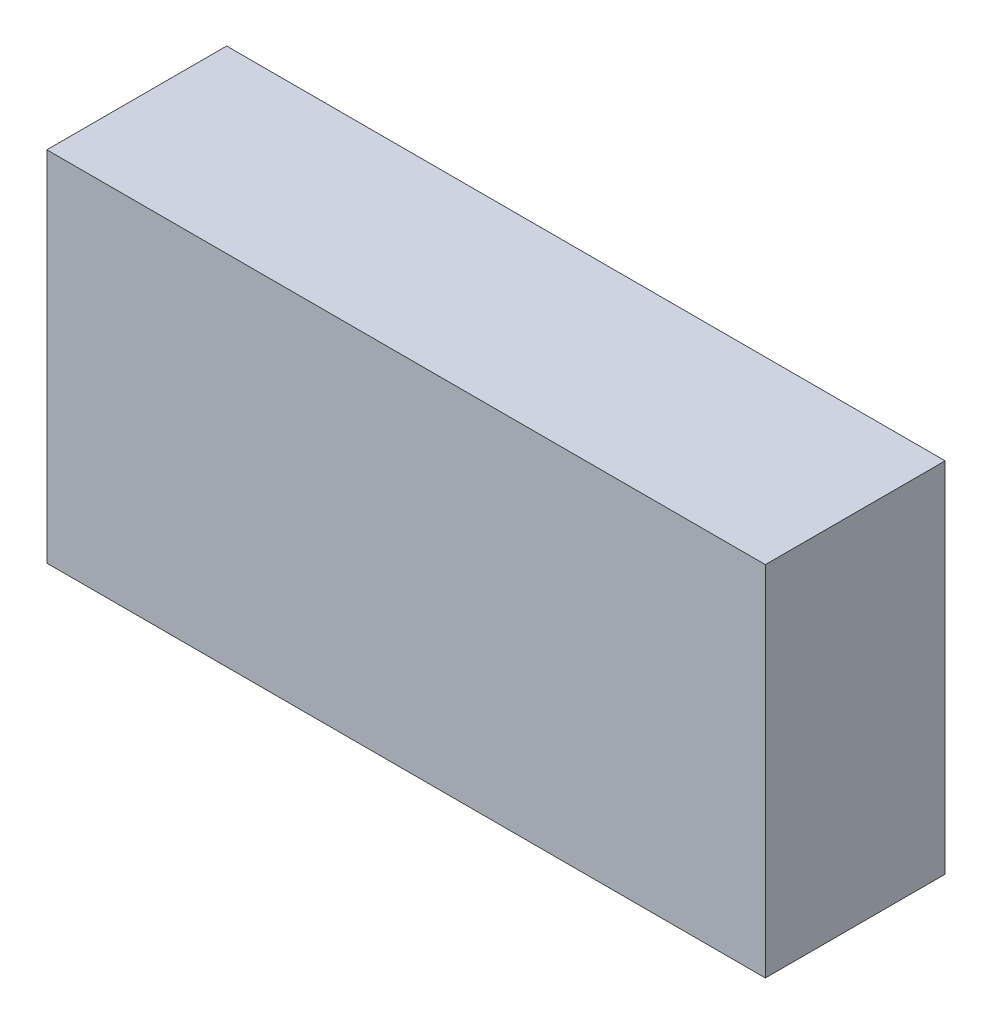
ISO-10303-21;
HEADER;
FILE_DESCRIPTION(('STEP AP214'),'2;1');
FILE_NAME('part.step','',(''),(''),'','','');
FILE_SCHEMA(('AUTOMOTIVE_DESIGN { 1 0 10303 214 1 1 1 1 }'));
ENDSEC;
DATA;
#1=APPLICATION_CONTEXT('core data for automotive mechanical design processes');
#2=APPLICATION_PROTOCOL_DEFINITION('international standard','automotive_design',2000,#1);
#3=PRODUCT_CONTEXT('',#1,'mechanical');
#4=PRODUCT('Part','Part','',(#3));
#5=PRODUCT_RELATED_PRODUCT_CATEGORY('part','',(#4));
#6=PRODUCT_DEFINITION_FORMATION('','',#4);
#7=PRODUCT_DEFINITION_CONTEXT('part definition',#1,'design');
#8=PRODUCT_DEFINITION('design','',#6,#7);
#9=PRODUCT_DEFINITION_SHAPE('','',#8);
#10=(LENGTH_UNIT() NAMED_UNIT(*) SI_UNIT(.MILLI.,.METRE.));
#11=(NAMED_UNIT(*) PLANE_ANGLE_UNIT() SI_UNIT($,.RADIAN.));
#12=(NAMED_UNIT(*) SI_UNIT($,.STERADIAN.) SOLID_ANGLE_UNIT());
#13=UNCERTAINTY_MEASURE_WITH_UNIT(LENGTH_MEASURE(1.E-05),#10,'distance_accuracy_value','');
#14=(GEOMETRIC_REPRESENTATION_CONTEXT(3) GLOBAL_UNCERTAINTY_ASSIGNED_CONTEXT((#13)) GLOBAL_UNIT_ASSIGNED_CONTEXT((#10,
#11,#12)) REPRESENTATION_CONTEXT('',''));
#15=CARTESIAN_POINT('',(0.,0.,0.));
#16=DIRECTION('',(0.,0.,1.));
#17=DIRECTION('',(1.,0.,0.));
#18=AXIS2_PLACEMENT_3D('',#15,#16,#17);
#19=CARTESIAN_POINT('',(-1.9984,-0.983,1.));
#20=DIRECTION('',(1.,0.,0.));
#21=DIRECTION('',(0.,0.,-1.));
#22=AXIS2_PLACEMENT_3D('',#19,#20,#21);
#23=PLANE('',#22);
#24=DIRECTION('',(0.,-1.,0.));
#25=VECTOR('',#24,1.);
#26=CARTESIAN_POINT('',(-1.9984,-0.983,0.));
#27=LINE('',#26,#25);
#28=CARTESIAN_POINT('',(-1.9984,1.0084,0.));
#29=VERTEX_POINT('',#28);
#30=CARTESIAN_POINT('',(-1.9984,-0.983,0.));
#31=VERTEX_POINT('',#30);
#32=EDGE_CURVE('E95',#29,#31,#27,.T.);
#33=ORIENTED_EDGE('',*,*,#32,.T.);
#34=DIRECTION('',(0.,0.,-1.));
#35=VECTOR('',#34,1.);
#36=CARTESIAN_POINT('',(-1.9984,-0.983,1.));
#37=LINE('',#36,#35);
#38=CARTESIAN_POINT('',(-1.9984,-0.983,1.));
#39=VERTEX_POINT('',#38);
#40=EDGE_CURVE('E11',#39,#31,#37,.T.);
#41=ORIENTED_EDGE('',*,*,#40,.F.);
#42=DIRECTION('',(0.,-1.,0.));
#43=VECTOR('',#42,1.);
#44=CARTESIAN_POINT('',(-1.9984,-0.983,1.));
#45=LINE('',#44,#43);
#46=CARTESIAN_POINT('',(-1.9984,1.0084,1.));
#47=VERTEX_POINT('',#46);
#48=EDGE_CURVE('E83',#47,#39,#45,.T.);
#49=ORIENTED_EDGE('',*,*,#48,.F.);
#50=DIRECTION('',(0.,0.,-1.));
#51=VECTOR('',#50,1.);
#52=CARTESIAN_POINT('',(-1.9984,1.0084,1.));
#53=LINE('',#52,#51);
#54=EDGE_CURVE('E91',#47,#29,#53,.T.);
#55=ORIENTED_EDGE('',*,*,#54,.T.);
#56=EDGE_LOOP('',(#33,#41,#49,#55));
#57=FACE_BOUND('',#56,.T.);
#58=ADVANCED_FACE('F32',(#57),#23,.F.);
#59=CARTESIAN_POINT('',(1.9984,-0.983,1.));
#60=DIRECTION('',(0.,1.,0.));
#61=DIRECTION('',(0.,0.,1.));
#62=AXIS2_PLACEMENT_3D('',#59,#60,#61);
#63=PLANE('',#62);
#64=DIRECTION('',(1.,0.,0.));
#65=VECTOR('',#64,1.);
#66=CARTESIAN_POINT('',(1.9984,-0.983,0.));
#67=LINE('',#66,#65);
#68=CARTESIAN_POINT('',(1.9984,-0.983,0.));
#69=VERTEX_POINT('',#68);
#70=EDGE_CURVE('E87',#31,#69,#67,.T.);
#71=ORIENTED_EDGE('',*,*,#70,.T.);
#72=DIRECTION('',(0.,0.,-1.));
#73=VECTOR('',#72,1.);
#74=CARTESIAN_POINT('',(1.9984,-0.983,1.));
#75=LINE('',#74,#73);
#76=CARTESIAN_POINT('',(1.9984,-0.983,1.));
#77=VERTEX_POINT('',#76);
#78=EDGE_CURVE('E40',#77,#69,#75,.T.);
#79=ORIENTED_EDGE('',*,*,#78,.F.);
#80=DIRECTION('',(1.,0.,0.));
#81=VECTOR('',#80,1.);
#82=CARTESIAN_POINT('',(1.9984,-0.983,1.));
#83=LINE('',#82,#81);
#84=EDGE_CURVE('E78',#39,#77,#83,.T.);
#85=ORIENTED_EDGE('',*,*,#84,.F.);
#86=ORIENTED_EDGE('',*,*,#40,.T.);
#87=EDGE_LOOP('',(#71,#79,#85,#86));
#88=FACE_BOUND('',#87,.T.);
#89=ADVANCED_FACE('F86',(#88),#63,.F.);
#90=CARTESIAN_POINT('',(1.9984,1.0084,1.));
#91=DIRECTION('',(-1.,0.,0.));
#92=DIRECTION('',(0.,0.,1.));
#93=AXIS2_PLACEMENT_3D('',#90,#91,#92);
#94=PLANE('',#93);
#95=DIRECTION('',(0.,1.,0.));
#96=VECTOR('',#95,1.);
#97=CARTESIAN_POINT('',(1.9984,1.0084,0.));
#98=LINE('',#97,#96);
#99=CARTESIAN_POINT('',(1.9984,1.0084,0.));
#100=VERTEX_POINT('',#99);
#101=EDGE_CURVE('E65',#69,#100,#98,.T.);
#102=ORIENTED_EDGE('',*,*,#101,.T.);
#103=DIRECTION('',(0.,0.,-1.));
#104=VECTOR('',#103,1.);
#105=CARTESIAN_POINT('',(1.9984,1.0084,1.));
#106=LINE('',#105,#104);
#107=CARTESIAN_POINT('',(1.9984,1.0084,1.));
#108=VERTEX_POINT('',#107);
#109=EDGE_CURVE('E88',#108,#100,#106,.T.);
#110=ORIENTED_EDGE('',*,*,#109,.F.);
#111=DIRECTION('',(0.,1.,0.));
#112=VECTOR('',#111,1.);
#113=CARTESIAN_POINT('',(1.9984,1.0084,1.));
#114=LINE('',#113,#112);
#115=EDGE_CURVE('E81',#77,#108,#114,.T.);
#116=ORIENTED_EDGE('',*,*,#115,.F.);
#117=ORIENTED_EDGE('',*,*,#78,.T.);
#118=EDGE_LOOP('',(#102,#110,#116,#117));
#119=FACE_BOUND('',#118,.T.);
#120=ADVANCED_FACE('F89',(#119),#94,.F.);
#121=CARTESIAN_POINT('',(-1.9984,1.0084,1.));
#122=DIRECTION('',(0.,-1.,0.));
#123=DIRECTION('',(0.,0.,-1.));
#124=AXIS2_PLACEMENT_3D('',#121,#122,#123);
#125=PLANE('',#124);
#126=DIRECTION('',(-1.,0.,0.));
#127=VECTOR('',#126,1.);
#128=CARTESIAN_POINT('',(-1.9984,1.0084,0.));
#129=LINE('',#128,#127);
#130=EDGE_CURVE('E71',#100,#29,#129,.T.);
#131=ORIENTED_EDGE('',*,*,#130,.T.);
#132=ORIENTED_EDGE('',*,*,#54,.F.);
#133=DIRECTION('',(-1.,0.,0.));
#134=VECTOR('',#133,1.);
#135=CARTESIAN_POINT('',(-1.9984,1.0084,1.));
#136=LINE('',#135,#134);
#137=EDGE_CURVE('E48',#108,#47,#136,.T.);
#138=ORIENTED_EDGE('',*,*,#137,.F.);
#139=ORIENTED_EDGE('',*,*,#109,.T.);
#140=EDGE_LOOP('',(#131,#132,#138,#139));
#141=FACE_BOUND('',#140,.T.);
#142=ADVANCED_FACE('F102',(#141),#125,.F.);
#143=CARTESIAN_POINT('',(0.,0.,1.));
#144=DIRECTION('',(0.,0.,-1.));
#145=DIRECTION('',(-1.,0.,0.));
#146=AXIS2_PLACEMENT_3D('',#143,#144,#145);
#147=PLANE('',#146);
#148=ORIENTED_EDGE('',*,*,#48,.T.);
#149=ORIENTED_EDGE('',*,*,#84,.T.);
#150=ORIENTED_EDGE('',*,*,#115,.T.);
#151=ORIENTED_EDGE('',*,*,#137,.T.);
#152=EDGE_LOOP('',(#148,#149,#150,#151));
#153=FACE_BOUND('',#152,.T.);
#154=ADVANCED_FACE('F79',(#153),#147,.F.);
#155=CARTESIAN_POINT('',(0.,0.,0.));
#156=DIRECTION('',(0.,0.,-1.));
#157=DIRECTION('',(-1.,0.,0.));
#158=AXIS2_PLACEMENT_3D('',#155,#156,#157);
#159=PLANE('',#158);
#160=ORIENTED_EDGE('',*,*,#32,.F.);
#161=ORIENTED_EDGE('',*,*,#130,.F.);
#162=ORIENTED_EDGE('',*,*,#101,.F.);
#163=ORIENTED_EDGE('',*,*,#70,.F.);
#164=EDGE_LOOP('',(#160,#161,#162,#163));
#165=FACE_BOUND('',#164,.T.);
#166=ADVANCED_FACE('F105',(#165),#159,.T.);
#167=CLOSED_SHELL('',(#58,#89,#120,#142,#154,#166));
#168=MANIFOLD_SOLID_BREP('B2',#167);
#169=ADVANCED_BREP_SHAPE_REPRESENTATION('',(#18,#168),#14);
#170=SHAPE_DEFINITION_REPRESENTATION(#9,#169);
ENDSEC;
END-ISO-10303-21;
